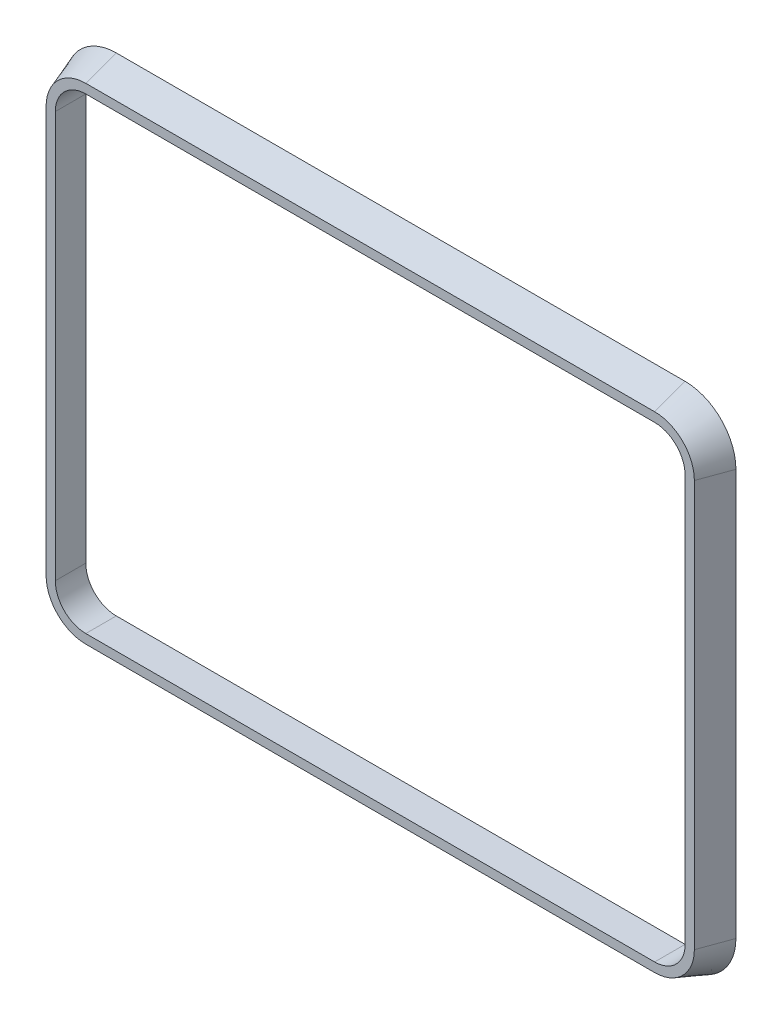
ISO-10303-21;
HEADER;
FILE_DESCRIPTION(('STEP AP214'),'2;1');
FILE_NAME('part.step','',(''),(''),'','','');
FILE_SCHEMA(('AUTOMOTIVE_DESIGN { 1 0 10303 214 1 1 1 1 }'));
ENDSEC;
DATA;
#1=APPLICATION_CONTEXT('core data for automotive mechanical design processes');
#2=APPLICATION_PROTOCOL_DEFINITION('international standard','automotive_design',2000,#1);
#3=PRODUCT_CONTEXT('',#1,'mechanical');
#4=PRODUCT('Part','Part','',(#3));
#5=PRODUCT_RELATED_PRODUCT_CATEGORY('part','',(#4));
#6=PRODUCT_DEFINITION_FORMATION('','',#4);
#7=PRODUCT_DEFINITION_CONTEXT('part definition',#1,'design');
#8=PRODUCT_DEFINITION('design','',#6,#7);
#9=PRODUCT_DEFINITION_SHAPE('','',#8);
#10=(LENGTH_UNIT() NAMED_UNIT(*) SI_UNIT(.MILLI.,.METRE.));
#11=(NAMED_UNIT(*) PLANE_ANGLE_UNIT() SI_UNIT($,.RADIAN.));
#12=(NAMED_UNIT(*) SI_UNIT($,.STERADIAN.) SOLID_ANGLE_UNIT());
#13=UNCERTAINTY_MEASURE_WITH_UNIT(LENGTH_MEASURE(1.E-05),#10,'distance_accuracy_value','');
#14=(GEOMETRIC_REPRESENTATION_CONTEXT(3) GLOBAL_UNCERTAINTY_ASSIGNED_CONTEXT((#13)) GLOBAL_UNIT_ASSIGNED_CONTEXT((#10,
#11,#12)) REPRESENTATION_CONTEXT('',''));
#15=CARTESIAN_POINT('',(0.,0.,0.));
#16=DIRECTION('',(0.,0.,1.));
#17=DIRECTION('',(1.,0.,0.));
#18=AXIS2_PLACEMENT_3D('',#15,#16,#17);
#19=CARTESIAN_POINT('',(-28.,-20.,0.));
#20=DIRECTION('',(0.,0.,-1.));
#21=DIRECTION('',(-1.,0.,0.));
#22=AXIS2_PLACEMENT_3D('',#19,#20,#21);
#23=CONICAL_SURFACE('',#22,5.,0.349065850398867);
#24=CARTESIAN_POINT('',(-28.,-20.,0.));
#25=DIRECTION('',(0.,0.,1.));
#26=DIRECTION('',(-1.,0.,0.));
#27=AXIS2_PLACEMENT_3D('',#24,#25,#26);
#28=CIRCLE('',#27,5.);
#29=CARTESIAN_POINT('',(-33.,-20.,0.));
#30=VERTEX_POINT('',#29);
#31=CARTESIAN_POINT('',(-28.,-25.,0.));
#32=VERTEX_POINT('',#31);
#33=EDGE_CURVE('E205',#30,#32,#28,.T.);
#34=ORIENTED_EDGE('',*,*,#33,.T.);
#35=DIRECTION('',(0.,-0.342020143325669,-0.939692620785908));
#36=VECTOR('',#35,1.);
#37=CARTESIAN_POINT('',(-28.,-25.,0.));
#38=LINE('',#37,#36);
#39=CARTESIAN_POINT('',(-28.,-23.9080892972014,3.));
#40=VERTEX_POINT('',#39);
#41=EDGE_CURVE('E11',#40,#32,#38,.T.);
#42=ORIENTED_EDGE('',*,*,#41,.F.);
#43=CARTESIAN_POINT('',(-28.,-20.,3.));
#44=DIRECTION('',(0.,0.,-1.));
#45=DIRECTION('',(-1.,0.,0.));
#46=AXIS2_PLACEMENT_3D('',#43,#44,#45);
#47=CIRCLE('',#46,3.90808929720139);
#48=CARTESIAN_POINT('',(-31.9080892972014,-20.,3.));
#49=VERTEX_POINT('',#48);
#50=EDGE_CURVE('E232',#49,#40,#47,.F.);
#51=ORIENTED_EDGE('',*,*,#50,.F.);
#52=DIRECTION('',(-0.342020143325669,0.,-0.939692620785908));
#53=VECTOR('',#52,1.);
#54=CARTESIAN_POINT('',(-33.,-20.,0.));
#55=LINE('',#54,#53);
#56=EDGE_CURVE('E234',#49,#30,#55,.T.);
#57=ORIENTED_EDGE('',*,*,#56,.T.);
#58=EDGE_LOOP('',(#34,#42,#51,#57));
#59=FACE_BOUND('',#58,.T.);
#60=ADVANCED_FACE('F33',(#59),#23,.T.);
#61=CARTESIAN_POINT('',(-28.,-25.,0.));
#62=DIRECTION('',(0.,-0.939692620785908,0.342020143325669));
#63=DIRECTION('',(0.,-0.342020143325669,-0.939692620785908));
#64=AXIS2_PLACEMENT_3D('',#61,#62,#63);
#65=PLANE('',#64);
#66=DIRECTION('',(1.,0.,0.));
#67=VECTOR('',#66,1.);
#68=CARTESIAN_POINT('',(-28.,-25.,0.));
#69=LINE('',#68,#67);
#70=CARTESIAN_POINT('',(28.,-25.,0.));
#71=VERTEX_POINT('',#70);
#72=EDGE_CURVE('E219',#32,#71,#69,.T.);
#73=ORIENTED_EDGE('',*,*,#72,.T.);
#74=DIRECTION('',(0.,-0.342020143325669,-0.939692620785908));
#75=VECTOR('',#74,1.);
#76=CARTESIAN_POINT('',(28.,-25.,0.));
#77=LINE('',#76,#75);
#78=CARTESIAN_POINT('',(28.,-23.9080892972014,3.));
#79=VERTEX_POINT('',#78);
#80=EDGE_CURVE('E42',#79,#71,#77,.T.);
#81=ORIENTED_EDGE('',*,*,#80,.F.);
#82=DIRECTION('',(-1.,0.,0.));
#83=VECTOR('',#82,1.);
#84=CARTESIAN_POINT('',(-28.,-23.9080892972014,3.));
#85=LINE('',#84,#83);
#86=EDGE_CURVE('E256',#40,#79,#85,.F.);
#87=ORIENTED_EDGE('',*,*,#86,.F.);
#88=ORIENTED_EDGE('',*,*,#41,.T.);
#89=EDGE_LOOP('',(#73,#81,#87,#88));
#90=FACE_BOUND('',#89,.T.);
#91=ADVANCED_FACE('F35',(#90),#65,.T.);
#92=CARTESIAN_POINT('',(28.,-20.,0.));
#93=DIRECTION('',(0.,0.,-1.));
#94=DIRECTION('',(1.,0.,0.));
#95=AXIS2_PLACEMENT_3D('',#92,#93,#94);
#96=CONICAL_SURFACE('',#95,5.,0.349065850398867);
#97=CARTESIAN_POINT('',(28.,-20.,0.));
#98=DIRECTION('',(0.,0.,1.));
#99=DIRECTION('',(1.,0.,0.));
#100=AXIS2_PLACEMENT_3D('',#97,#98,#99);
#101=CIRCLE('',#100,5.);
#102=CARTESIAN_POINT('',(33.,-20.,0.));
#103=VERTEX_POINT('',#102);
#104=EDGE_CURVE('E221',#71,#103,#101,.T.);
#105=ORIENTED_EDGE('',*,*,#104,.T.);
#106=DIRECTION('',(0.342020143325669,0.,-0.939692620785908));
#107=VECTOR('',#106,1.);
#108=CARTESIAN_POINT('',(33.,-20.,0.));
#109=LINE('',#108,#107);
#110=CARTESIAN_POINT('',(31.9080892972014,-20.,3.));
#111=VERTEX_POINT('',#110);
#112=EDGE_CURVE('E249',#111,#103,#109,.T.);
#113=ORIENTED_EDGE('',*,*,#112,.F.);
#114=CARTESIAN_POINT('',(28.,-20.,3.));
#115=DIRECTION('',(0.,0.,-1.));
#116=DIRECTION('',(-1.,0.,0.));
#117=AXIS2_PLACEMENT_3D('',#114,#115,#116);
#118=CIRCLE('',#117,3.90808929720139);
#119=EDGE_CURVE('E258',#79,#111,#118,.F.);
#120=ORIENTED_EDGE('',*,*,#119,.F.);
#121=ORIENTED_EDGE('',*,*,#80,.T.);
#122=EDGE_LOOP('',(#105,#113,#120,#121));
#123=FACE_BOUND('',#122,.T.);
#124=ADVANCED_FACE('F286',(#123),#96,.T.);
#125=CARTESIAN_POINT('',(33.,-20.,0.));
#126=DIRECTION('',(0.939692620785908,0.,0.342020143325669));
#127=DIRECTION('',(0.342020143325669,0.,-0.939692620785908));
#128=AXIS2_PLACEMENT_3D('',#125,#126,#127);
#129=PLANE('',#128);
#130=DIRECTION('',(0.,1.,0.));
#131=VECTOR('',#130,1.);
#132=CARTESIAN_POINT('',(33.,-20.,0.));
#133=LINE('',#132,#131);
#134=CARTESIAN_POINT('',(33.,20.,0.));
#135=VERTEX_POINT('',#134);
#136=EDGE_CURVE('E223',#103,#135,#133,.T.);
#137=ORIENTED_EDGE('',*,*,#136,.T.);
#138=DIRECTION('',(0.342020143325669,0.,-0.939692620785908));
#139=VECTOR('',#138,1.);
#140=CARTESIAN_POINT('',(33.,20.,0.));
#141=LINE('',#140,#139);
#142=CARTESIAN_POINT('',(31.9080892972014,20.,3.));
#143=VERTEX_POINT('',#142);
#144=EDGE_CURVE('E246',#143,#135,#141,.T.);
#145=ORIENTED_EDGE('',*,*,#144,.F.);
#146=DIRECTION('',(0.,-1.,0.));
#147=VECTOR('',#146,1.);
#148=CARTESIAN_POINT('',(31.9080892972014,-20.,3.));
#149=LINE('',#148,#147);
#150=EDGE_CURVE('E260',#111,#143,#149,.F.);
#151=ORIENTED_EDGE('',*,*,#150,.F.);
#152=ORIENTED_EDGE('',*,*,#112,.T.);
#153=EDGE_LOOP('',(#137,#145,#151,#152));
#154=FACE_BOUND('',#153,.T.);
#155=ADVANCED_FACE('F290',(#154),#129,.T.);
#156=CARTESIAN_POINT('',(28.,20.,0.));
#157=DIRECTION('',(0.,0.,-1.));
#158=DIRECTION('',(-1.,0.,0.));
#159=AXIS2_PLACEMENT_3D('',#156,#157,#158);
#160=CONICAL_SURFACE('',#159,5.,0.349065850398867);
#161=CARTESIAN_POINT('',(28.,20.,0.));
#162=DIRECTION('',(0.,0.,1.));
#163=DIRECTION('',(-1.,0.,0.));
#164=AXIS2_PLACEMENT_3D('',#161,#162,#163);
#165=CIRCLE('',#164,5.);
#166=CARTESIAN_POINT('',(28.,25.,0.));
#167=VERTEX_POINT('',#166);
#168=EDGE_CURVE('E225',#135,#167,#165,.T.);
#169=ORIENTED_EDGE('',*,*,#168,.T.);
#170=DIRECTION('',(0.,0.342020143325669,-0.939692620785908));
#171=VECTOR('',#170,1.);
#172=CARTESIAN_POINT('',(28.,25.,0.));
#173=LINE('',#172,#171);
#174=CARTESIAN_POINT('',(28.,23.9080892972014,3.));
#175=VERTEX_POINT('',#174);
#176=EDGE_CURVE('E243',#175,#167,#173,.T.);
#177=ORIENTED_EDGE('',*,*,#176,.F.);
#178=CARTESIAN_POINT('',(28.,20.,3.));
#179=DIRECTION('',(0.,0.,-1.));
#180=DIRECTION('',(-1.,0.,0.));
#181=AXIS2_PLACEMENT_3D('',#178,#179,#180);
#182=CIRCLE('',#181,3.90808929720139);
#183=EDGE_CURVE('E262',#143,#175,#182,.F.);
#184=ORIENTED_EDGE('',*,*,#183,.F.);
#185=ORIENTED_EDGE('',*,*,#144,.T.);
#186=EDGE_LOOP('',(#169,#177,#184,#185));
#187=FACE_BOUND('',#186,.T.);
#188=ADVANCED_FACE('F295',(#187),#160,.T.);
#189=CARTESIAN_POINT('',(-28.,25.,0.));
#190=DIRECTION('',(0.,0.939692620785908,0.342020143325669));
#191=DIRECTION('',(0.,-0.342020143325669,0.939692620785908));
#192=AXIS2_PLACEMENT_3D('',#189,#190,#191);
#193=PLANE('',#192);
#194=DIRECTION('',(-1.,0.,0.));
#195=VECTOR('',#194,1.);
#196=CARTESIAN_POINT('',(-28.,25.,0.));
#197=LINE('',#196,#195);
#198=CARTESIAN_POINT('',(-28.,25.,0.));
#199=VERTEX_POINT('',#198);
#200=EDGE_CURVE('E227',#167,#199,#197,.T.);
#201=ORIENTED_EDGE('',*,*,#200,.T.);
#202=DIRECTION('',(0.,0.342020143325669,-0.939692620785908));
#203=VECTOR('',#202,1.);
#204=CARTESIAN_POINT('',(-28.,25.,0.));
#205=LINE('',#204,#203);
#206=CARTESIAN_POINT('',(-28.,23.9080892972014,3.));
#207=VERTEX_POINT('',#206);
#208=EDGE_CURVE('E240',#207,#199,#205,.T.);
#209=ORIENTED_EDGE('',*,*,#208,.F.);
#210=DIRECTION('',(1.,0.,0.));
#211=VECTOR('',#210,1.);
#212=CARTESIAN_POINT('',(-28.,23.9080892972014,3.));
#213=LINE('',#212,#211);
#214=EDGE_CURVE('E264',#175,#207,#213,.F.);
#215=ORIENTED_EDGE('',*,*,#214,.F.);
#216=ORIENTED_EDGE('',*,*,#176,.T.);
#217=EDGE_LOOP('',(#201,#209,#215,#216));
#218=FACE_BOUND('',#217,.T.);
#219=ADVANCED_FACE('F299',(#218),#193,.T.);
#220=CARTESIAN_POINT('',(-28.,20.,0.));
#221=DIRECTION('',(0.,0.,-1.));
#222=DIRECTION('',(-1.,0.,0.));
#223=AXIS2_PLACEMENT_3D('',#220,#221,#222);
#224=CONICAL_SURFACE('',#223,5.,0.349065850398867);
#225=CARTESIAN_POINT('',(-28.,20.,0.));
#226=DIRECTION('',(0.,0.,1.));
#227=DIRECTION('',(-1.,0.,0.));
#228=AXIS2_PLACEMENT_3D('',#225,#226,#227);
#229=CIRCLE('',#228,5.);
#230=CARTESIAN_POINT('',(-33.,20.,0.));
#231=VERTEX_POINT('',#230);
#232=EDGE_CURVE('E229',#199,#231,#229,.T.);
#233=ORIENTED_EDGE('',*,*,#232,.T.);
#234=DIRECTION('',(-0.342020143325669,0.,-0.939692620785908));
#235=VECTOR('',#234,1.);
#236=CARTESIAN_POINT('',(-33.,20.,0.));
#237=LINE('',#236,#235);
#238=CARTESIAN_POINT('',(-31.9080892972014,20.,3.));
#239=VERTEX_POINT('',#238);
#240=EDGE_CURVE('E237',#239,#231,#237,.T.);
#241=ORIENTED_EDGE('',*,*,#240,.F.);
#242=CARTESIAN_POINT('',(-28.,20.,3.));
#243=DIRECTION('',(0.,0.,-1.));
#244=DIRECTION('',(-1.,0.,0.));
#245=AXIS2_PLACEMENT_3D('',#242,#243,#244);
#246=CIRCLE('',#245,3.90808929720139);
#247=EDGE_CURVE('E265',#207,#239,#246,.F.);
#248=ORIENTED_EDGE('',*,*,#247,.F.);
#249=ORIENTED_EDGE('',*,*,#208,.T.);
#250=EDGE_LOOP('',(#233,#241,#248,#249));
#251=FACE_BOUND('',#250,.T.);
#252=ADVANCED_FACE('F303',(#251),#224,.T.);
#253=CARTESIAN_POINT('',(-33.,-20.,0.));
#254=DIRECTION('',(-0.939692620785908,0.,0.342020143325669));
#255=DIRECTION('',(0.342020143325669,0.,0.939692620785908));
#256=AXIS2_PLACEMENT_3D('',#253,#254,#255);
#257=PLANE('',#256);
#258=DIRECTION('',(0.,-1.,0.));
#259=VECTOR('',#258,1.);
#260=CARTESIAN_POINT('',(-33.,-20.,0.));
#261=LINE('',#260,#259);
#262=EDGE_CURVE('E231',#231,#30,#261,.T.);
#263=ORIENTED_EDGE('',*,*,#262,.T.);
#264=ORIENTED_EDGE('',*,*,#56,.F.);
#265=DIRECTION('',(0.,1.,0.));
#266=VECTOR('',#265,1.);
#267=CARTESIAN_POINT('',(-31.9080892972014,-20.,3.));
#268=LINE('',#267,#266);
#269=EDGE_CURVE('E37',#239,#49,#268,.F.);
#270=ORIENTED_EDGE('',*,*,#269,.F.);
#271=ORIENTED_EDGE('',*,*,#240,.T.);
#272=EDGE_LOOP('',(#263,#264,#270,#271));
#273=FACE_BOUND('',#272,.T.);
#274=ADVANCED_FACE('F275',(#273),#257,.T.);
#275=CARTESIAN_POINT('',(-28.,-20.,3.));
#276=DIRECTION('',(0.,0.,-1.));
#277=DIRECTION('',(-1.,0.,0.));
#278=AXIS2_PLACEMENT_3D('',#275,#276,#277);
#279=PLANE('',#278);
#280=DIRECTION('',(1.,0.,0.));
#281=VECTOR('',#280,1.);
#282=CARTESIAN_POINT('',(-28.,-23.,3.));
#283=LINE('',#282,#281);
#284=CARTESIAN_POINT('',(-28.,-23.,3.));
#285=VERTEX_POINT('',#284);
#286=CARTESIAN_POINT('',(28.,-23.,3.));
#287=VERTEX_POINT('',#286);
#288=EDGE_CURVE('E187',#285,#287,#283,.T.);
#289=ORIENTED_EDGE('',*,*,#288,.F.);
#290=CARTESIAN_POINT('',(-28.,-20.,3.));
#291=DIRECTION('',(0.,0.,1.));
#292=DIRECTION('',(-1.,0.,0.));
#293=AXIS2_PLACEMENT_3D('',#290,#291,#292);
#294=CIRCLE('',#293,3.);
#295=CARTESIAN_POINT('',(-31.,-20.,3.));
#296=VERTEX_POINT('',#295);
#297=EDGE_CURVE('E50',#296,#285,#294,.T.);
#298=ORIENTED_EDGE('',*,*,#297,.F.);
#299=DIRECTION('',(0.,-1.,0.));
#300=VECTOR('',#299,1.);
#301=CARTESIAN_POINT('',(-31.,-20.,3.));
#302=LINE('',#301,#300);
#303=CARTESIAN_POINT('',(-31.,20.,3.));
#304=VERTEX_POINT('',#303);
#305=EDGE_CURVE('E167',#304,#296,#302,.T.);
#306=ORIENTED_EDGE('',*,*,#305,.F.);
#307=CARTESIAN_POINT('',(-28.,20.,3.));
#308=DIRECTION('',(0.,0.,1.));
#309=DIRECTION('',(-1.,0.,0.));
#310=AXIS2_PLACEMENT_3D('',#307,#308,#309);
#311=CIRCLE('',#310,3.);
#312=CARTESIAN_POINT('',(-28.,23.,3.));
#313=VERTEX_POINT('',#312);
#314=EDGE_CURVE('E170',#313,#304,#311,.T.);
#315=ORIENTED_EDGE('',*,*,#314,.F.);
#316=DIRECTION('',(-1.,0.,0.));
#317=VECTOR('',#316,1.);
#318=CARTESIAN_POINT('',(-28.,23.,3.));
#319=LINE('',#318,#317);
#320=CARTESIAN_POINT('',(28.,23.,3.));
#321=VERTEX_POINT('',#320);
#322=EDGE_CURVE('E198',#321,#313,#319,.T.);
#323=ORIENTED_EDGE('',*,*,#322,.F.);
#324=CARTESIAN_POINT('',(28.,20.,3.));
#325=DIRECTION('',(0.,0.,1.));
#326=DIRECTION('',(-1.,0.,0.));
#327=AXIS2_PLACEMENT_3D('',#324,#325,#326);
#328=CIRCLE('',#327,3.);
#329=CARTESIAN_POINT('',(31.,20.,3.));
#330=VERTEX_POINT('',#329);
#331=EDGE_CURVE('E195',#330,#321,#328,.T.);
#332=ORIENTED_EDGE('',*,*,#331,.F.);
#333=DIRECTION('',(0.,1.,0.));
#334=VECTOR('',#333,1.);
#335=CARTESIAN_POINT('',(31.,-20.,3.));
#336=LINE('',#335,#334);
#337=CARTESIAN_POINT('',(31.,-20.,3.));
#338=VERTEX_POINT('',#337);
#339=EDGE_CURVE('E192',#338,#330,#336,.T.);
#340=ORIENTED_EDGE('',*,*,#339,.F.);
#341=CARTESIAN_POINT('',(28.,-20.,3.));
#342=DIRECTION('',(0.,0.,1.));
#343=DIRECTION('',(1.,0.,0.));
#344=AXIS2_PLACEMENT_3D('',#341,#342,#343);
#345=CIRCLE('',#344,3.);
#346=EDGE_CURVE('E189',#287,#338,#345,.T.);
#347=ORIENTED_EDGE('',*,*,#346,.F.);
#348=EDGE_LOOP('',(#289,#298,#306,#315,#323,#332,#340,#347));
#349=FACE_BOUND('',#348,.T.);
#350=ORIENTED_EDGE('',*,*,#50,.T.);
#351=ORIENTED_EDGE('',*,*,#86,.T.);
#352=ORIENTED_EDGE('',*,*,#119,.T.);
#353=ORIENTED_EDGE('',*,*,#150,.T.);
#354=ORIENTED_EDGE('',*,*,#183,.T.);
#355=ORIENTED_EDGE('',*,*,#214,.T.);
#356=ORIENTED_EDGE('',*,*,#247,.T.);
#357=ORIENTED_EDGE('',*,*,#269,.T.);
#358=EDGE_LOOP('',(#350,#351,#352,#353,#354,#355,#356,#357));
#359=FACE_BOUND('',#358,.T.);
#360=ADVANCED_FACE('F271',(#349,#359),#279,.F.);
#361=CARTESIAN_POINT('',(-28.,-20.,0.));
#362=DIRECTION('',(0.,0.,-1.));
#363=DIRECTION('',(-1.,0.,0.));
#364=AXIS2_PLACEMENT_3D('',#361,#362,#363);
#365=PLANE('',#364);
#366=CARTESIAN_POINT('',(-28.,-20.,0.));
#367=DIRECTION('',(0.,0.,1.));
#368=DIRECTION('',(-1.,0.,0.));
#369=AXIS2_PLACEMENT_3D('',#366,#367,#368);
#370=CIRCLE('',#369,3.);
#371=CARTESIAN_POINT('',(-31.,-20.,0.));
#372=VERTEX_POINT('',#371);
#373=CARTESIAN_POINT('',(-28.,-23.,0.));
#374=VERTEX_POINT('',#373);
#375=EDGE_CURVE('E150',#372,#374,#370,.T.);
#376=ORIENTED_EDGE('',*,*,#375,.T.);
#377=DIRECTION('',(1.,0.,0.));
#378=VECTOR('',#377,1.);
#379=CARTESIAN_POINT('',(-28.,-23.,0.));
#380=LINE('',#379,#378);
#381=CARTESIAN_POINT('',(28.,-23.,0.));
#382=VERTEX_POINT('',#381);
#383=EDGE_CURVE('E159',#374,#382,#380,.T.);
#384=ORIENTED_EDGE('',*,*,#383,.T.);
#385=CARTESIAN_POINT('',(28.,-20.,0.));
#386=DIRECTION('',(0.,0.,1.));
#387=DIRECTION('',(1.,0.,0.));
#388=AXIS2_PLACEMENT_3D('',#385,#386,#387);
#389=CIRCLE('',#388,3.);
#390=CARTESIAN_POINT('',(31.,-20.,0.));
#391=VERTEX_POINT('',#390);
#392=EDGE_CURVE('E58',#382,#391,#389,.T.);
#393=ORIENTED_EDGE('',*,*,#392,.T.);
#394=DIRECTION('',(0.,1.,0.));
#395=VECTOR('',#394,1.);
#396=CARTESIAN_POINT('',(31.,-20.,0.));
#397=LINE('',#396,#395);
#398=CARTESIAN_POINT('',(31.,20.,0.));
#399=VERTEX_POINT('',#398);
#400=EDGE_CURVE('E174',#391,#399,#397,.T.);
#401=ORIENTED_EDGE('',*,*,#400,.T.);
#402=CARTESIAN_POINT('',(28.,20.,0.));
#403=DIRECTION('',(0.,0.,1.));
#404=DIRECTION('',(-1.,0.,0.));
#405=AXIS2_PLACEMENT_3D('',#402,#403,#404);
#406=CIRCLE('',#405,3.);
#407=CARTESIAN_POINT('',(28.,23.,0.));
#408=VERTEX_POINT('',#407);
#409=EDGE_CURVE('E177',#399,#408,#406,.T.);
#410=ORIENTED_EDGE('',*,*,#409,.T.);
#411=DIRECTION('',(-1.,0.,0.));
#412=VECTOR('',#411,1.);
#413=CARTESIAN_POINT('',(-28.,23.,0.));
#414=LINE('',#413,#412);
#415=CARTESIAN_POINT('',(-28.,23.,0.));
#416=VERTEX_POINT('',#415);
#417=EDGE_CURVE('E180',#408,#416,#414,.T.);
#418=ORIENTED_EDGE('',*,*,#417,.T.);
#419=CARTESIAN_POINT('',(-28.,20.,0.));
#420=DIRECTION('',(0.,0.,1.));
#421=DIRECTION('',(-1.,0.,0.));
#422=AXIS2_PLACEMENT_3D('',#419,#420,#421);
#423=CIRCLE('',#422,3.);
#424=CARTESIAN_POINT('',(-31.,20.,0.));
#425=VERTEX_POINT('',#424);
#426=EDGE_CURVE('E183',#416,#425,#423,.T.);
#427=ORIENTED_EDGE('',*,*,#426,.T.);
#428=DIRECTION('',(0.,-1.,0.));
#429=VECTOR('',#428,1.);
#430=CARTESIAN_POINT('',(-31.,-20.,0.));
#431=LINE('',#430,#429);
#432=EDGE_CURVE('E156',#425,#372,#431,.T.);
#433=ORIENTED_EDGE('',*,*,#432,.T.);
#434=EDGE_LOOP('',(#376,#384,#393,#401,#410,#418,#427,#433));
#435=FACE_BOUND('',#434,.T.);
#436=ORIENTED_EDGE('',*,*,#33,.F.);
#437=ORIENTED_EDGE('',*,*,#262,.F.);
#438=ORIENTED_EDGE('',*,*,#232,.F.);
#439=ORIENTED_EDGE('',*,*,#200,.F.);
#440=ORIENTED_EDGE('',*,*,#168,.F.);
#441=ORIENTED_EDGE('',*,*,#136,.F.);
#442=ORIENTED_EDGE('',*,*,#104,.F.);
#443=ORIENTED_EDGE('',*,*,#72,.F.);
#444=EDGE_LOOP('',(#436,#437,#438,#439,#440,#441,#442,#443));
#445=FACE_BOUND('',#444,.T.);
#446=ADVANCED_FACE('F163',(#435,#445),#365,.T.);
#447=CARTESIAN_POINT('',(-28.,-20.,0.));
#448=DIRECTION('',(0.,0.,1.));
#449=DIRECTION('',(1.,0.,0.));
#450=AXIS2_PLACEMENT_3D('',#447,#448,#449);
#451=CYLINDRICAL_SURFACE('',#450,3.);
#452=ORIENTED_EDGE('',*,*,#297,.T.);
#453=DIRECTION('',(0.,0.,1.));
#454=VECTOR('',#453,1.);
#455=CARTESIAN_POINT('',(-28.,-23.,0.));
#456=LINE('',#455,#454);
#457=EDGE_CURVE('E146',#374,#285,#456,.T.);
#458=ORIENTED_EDGE('',*,*,#457,.F.);
#459=ORIENTED_EDGE('',*,*,#375,.F.);
#460=DIRECTION('',(0.,0.,1.));
#461=VECTOR('',#460,1.);
#462=CARTESIAN_POINT('',(-31.,-20.,0.));
#463=LINE('',#462,#461);
#464=EDGE_CURVE('E203',#372,#296,#463,.T.);
#465=ORIENTED_EDGE('',*,*,#464,.T.);
#466=EDGE_LOOP('',(#452,#458,#459,#465));
#467=FACE_BOUND('',#466,.T.);
#468=ADVANCED_FACE('F148',(#467),#451,.F.);
#469=CARTESIAN_POINT('',(-31.,-20.,0.));
#470=DIRECTION('',(-1.,0.,0.));
#471=DIRECTION('',(0.,0.,1.));
#472=AXIS2_PLACEMENT_3D('',#469,#470,#471);
#473=PLANE('',#472);
#474=ORIENTED_EDGE('',*,*,#305,.T.);
#475=ORIENTED_EDGE('',*,*,#464,.F.);
#476=ORIENTED_EDGE('',*,*,#432,.F.);
#477=DIRECTION('',(0.,0.,1.));
#478=VECTOR('',#477,1.);
#479=CARTESIAN_POINT('',(-31.,20.,0.));
#480=LINE('',#479,#478);
#481=EDGE_CURVE('E206',#425,#304,#480,.T.);
#482=ORIENTED_EDGE('',*,*,#481,.T.);
#483=EDGE_LOOP('',(#474,#475,#476,#482));
#484=FACE_BOUND('',#483,.T.);
#485=ADVANCED_FACE('F310',(#484),#473,.F.);
#486=CARTESIAN_POINT('',(-28.,20.,0.));
#487=DIRECTION('',(0.,0.,1.));
#488=DIRECTION('',(1.,0.,0.));
#489=AXIS2_PLACEMENT_3D('',#486,#487,#488);
#490=CYLINDRICAL_SURFACE('',#489,3.);
#491=ORIENTED_EDGE('',*,*,#314,.T.);
#492=ORIENTED_EDGE('',*,*,#481,.F.);
#493=ORIENTED_EDGE('',*,*,#426,.F.);
#494=DIRECTION('',(0.,0.,1.));
#495=VECTOR('',#494,1.);
#496=CARTESIAN_POINT('',(-28.,23.,0.));
#497=LINE('',#496,#495);
#498=EDGE_CURVE('E208',#416,#313,#497,.T.);
#499=ORIENTED_EDGE('',*,*,#498,.T.);
#500=EDGE_LOOP('',(#491,#492,#493,#499));
#501=FACE_BOUND('',#500,.T.);
#502=ADVANCED_FACE('F377',(#501),#490,.F.);
#503=CARTESIAN_POINT('',(-28.,23.,0.));
#504=DIRECTION('',(0.,1.,0.));
#505=DIRECTION('',(0.,0.,1.));
#506=AXIS2_PLACEMENT_3D('',#503,#504,#505);
#507=PLANE('',#506);
#508=ORIENTED_EDGE('',*,*,#322,.T.);
#509=ORIENTED_EDGE('',*,*,#498,.F.);
#510=ORIENTED_EDGE('',*,*,#417,.F.);
#511=DIRECTION('',(0.,0.,1.));
#512=VECTOR('',#511,1.);
#513=CARTESIAN_POINT('',(28.,23.,0.));
#514=LINE('',#513,#512);
#515=EDGE_CURVE('E210',#408,#321,#514,.T.);
#516=ORIENTED_EDGE('',*,*,#515,.T.);
#517=EDGE_LOOP('',(#508,#509,#510,#516));
#518=FACE_BOUND('',#517,.T.);
#519=ADVANCED_FACE('F387',(#518),#507,.F.);
#520=CARTESIAN_POINT('',(28.,20.,0.));
#521=DIRECTION('',(0.,0.,1.));
#522=DIRECTION('',(1.,0.,0.));
#523=AXIS2_PLACEMENT_3D('',#520,#521,#522);
#524=CYLINDRICAL_SURFACE('',#523,3.);
#525=ORIENTED_EDGE('',*,*,#331,.T.);
#526=ORIENTED_EDGE('',*,*,#515,.F.);
#527=ORIENTED_EDGE('',*,*,#409,.F.);
#528=DIRECTION('',(0.,0.,1.));
#529=VECTOR('',#528,1.);
#530=CARTESIAN_POINT('',(31.,20.,0.));
#531=LINE('',#530,#529);
#532=EDGE_CURVE('E212',#399,#330,#531,.T.);
#533=ORIENTED_EDGE('',*,*,#532,.T.);
#534=EDGE_LOOP('',(#525,#526,#527,#533));
#535=FACE_BOUND('',#534,.T.);
#536=ADVANCED_FACE('F397',(#535),#524,.F.);
#537=CARTESIAN_POINT('',(31.,-20.,0.));
#538=DIRECTION('',(1.,0.,0.));
#539=DIRECTION('',(0.,0.,-1.));
#540=AXIS2_PLACEMENT_3D('',#537,#538,#539);
#541=PLANE('',#540);
#542=ORIENTED_EDGE('',*,*,#339,.T.);
#543=ORIENTED_EDGE('',*,*,#532,.F.);
#544=ORIENTED_EDGE('',*,*,#400,.F.);
#545=DIRECTION('',(0.,0.,1.));
#546=VECTOR('',#545,1.);
#547=CARTESIAN_POINT('',(31.,-20.,0.));
#548=LINE('',#547,#546);
#549=EDGE_CURVE('E214',#391,#338,#548,.T.);
#550=ORIENTED_EDGE('',*,*,#549,.T.);
#551=EDGE_LOOP('',(#542,#543,#544,#550));
#552=FACE_BOUND('',#551,.T.);
#553=ADVANCED_FACE('F407',(#552),#541,.F.);
#554=CARTESIAN_POINT('',(28.,-20.,0.));
#555=DIRECTION('',(0.,0.,1.));
#556=DIRECTION('',(1.,0.,0.));
#557=AXIS2_PLACEMENT_3D('',#554,#555,#556);
#558=CYLINDRICAL_SURFACE('',#557,3.);
#559=ORIENTED_EDGE('',*,*,#346,.T.);
#560=ORIENTED_EDGE('',*,*,#549,.F.);
#561=ORIENTED_EDGE('',*,*,#392,.F.);
#562=DIRECTION('',(0.,0.,1.));
#563=VECTOR('',#562,1.);
#564=CARTESIAN_POINT('',(28.,-23.,0.));
#565=LINE('',#564,#563);
#566=EDGE_CURVE('E155',#382,#287,#565,.T.);
#567=ORIENTED_EDGE('',*,*,#566,.T.);
#568=EDGE_LOOP('',(#559,#560,#561,#567));
#569=FACE_BOUND('',#568,.T.);
#570=ADVANCED_FACE('F417',(#569),#558,.F.);
#571=CARTESIAN_POINT('',(-28.,-23.,0.));
#572=DIRECTION('',(0.,-1.,0.));
#573=DIRECTION('',(0.,0.,-1.));
#574=AXIS2_PLACEMENT_3D('',#571,#572,#573);
#575=PLANE('',#574);
#576=ORIENTED_EDGE('',*,*,#288,.T.);
#577=ORIENTED_EDGE('',*,*,#566,.F.);
#578=ORIENTED_EDGE('',*,*,#383,.F.);
#579=ORIENTED_EDGE('',*,*,#457,.T.);
#580=EDGE_LOOP('',(#576,#577,#578,#579));
#581=FACE_BOUND('',#580,.T.);
#582=ADVANCED_FACE('F160',(#581),#575,.F.);
#583=CLOSED_SHELL('',(#60,#91,#124,#155,#188,#219,#252,#274,#360,#446,#468,#485,#502,#519,#536,
#553,#570,#582));
#584=MANIFOLD_SOLID_BREP('B2',#583);
#585=ADVANCED_BREP_SHAPE_REPRESENTATION('',(#18,#584),#14);
#586=SHAPE_DEFINITION_REPRESENTATION(#9,#585);
ENDSEC;
END-ISO-10303-21;
